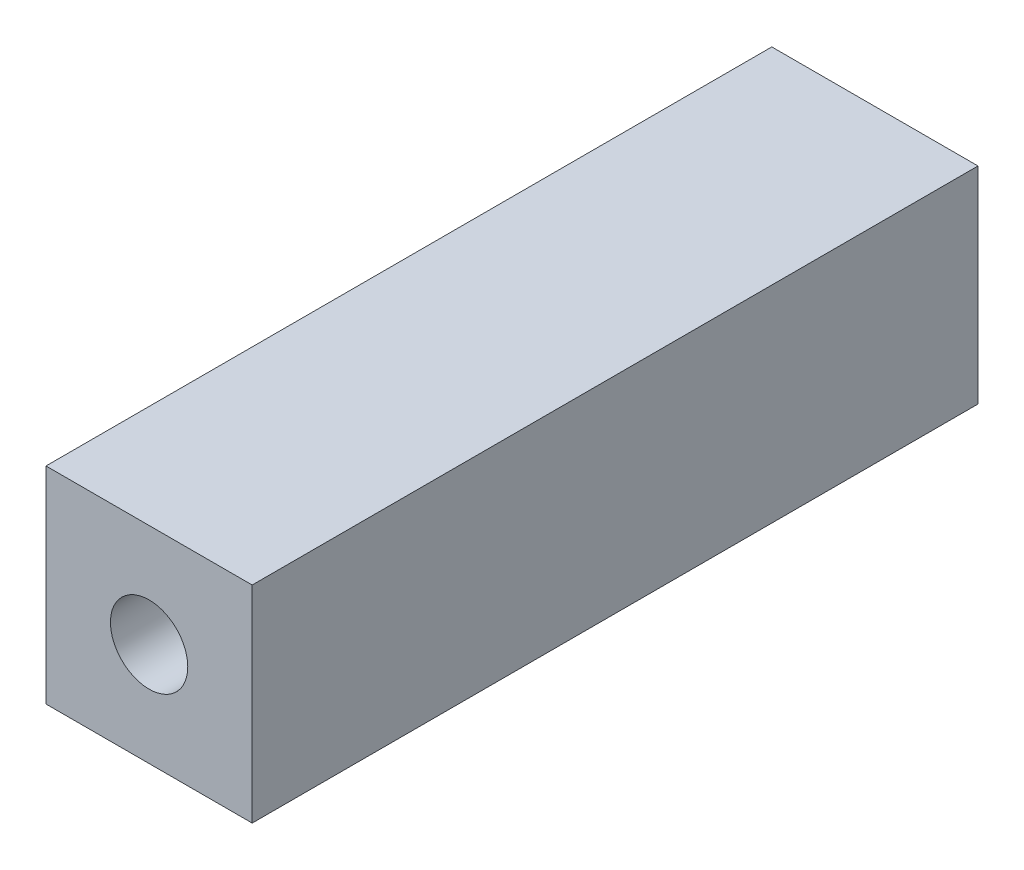
ISO-10303-21;
HEADER;
FILE_DESCRIPTION(('STEP AP214'),'2;1');
FILE_NAME('part.step','',(''),(''),'','','');
FILE_SCHEMA(('AUTOMOTIVE_DESIGN { 1 0 10303 214 1 1 1 1 }'));
ENDSEC;
DATA;
#1=APPLICATION_CONTEXT('core data for automotive mechanical design processes');
#2=APPLICATION_PROTOCOL_DEFINITION('international standard','automotive_design',2000,#1);
#3=PRODUCT_CONTEXT('',#1,'mechanical');
#4=PRODUCT('Part','Part','',(#3));
#5=PRODUCT_RELATED_PRODUCT_CATEGORY('part','',(#4));
#6=PRODUCT_DEFINITION_FORMATION('','',#4);
#7=PRODUCT_DEFINITION_CONTEXT('part definition',#1,'design');
#8=PRODUCT_DEFINITION('design','',#6,#7);
#9=PRODUCT_DEFINITION_SHAPE('','',#8);
#10=(LENGTH_UNIT() NAMED_UNIT(*) SI_UNIT(.MILLI.,.METRE.));
#11=(NAMED_UNIT(*) PLANE_ANGLE_UNIT() SI_UNIT($,.RADIAN.));
#12=(NAMED_UNIT(*) SI_UNIT($,.STERADIAN.) SOLID_ANGLE_UNIT());
#13=UNCERTAINTY_MEASURE_WITH_UNIT(LENGTH_MEASURE(1.E-05),#10,'distance_accuracy_value','');
#14=(GEOMETRIC_REPRESENTATION_CONTEXT(3) GLOBAL_UNCERTAINTY_ASSIGNED_CONTEXT((#13)) GLOBAL_UNIT_ASSIGNED_CONTEXT((#10,
#11,#12)) REPRESENTATION_CONTEXT('',''));
#15=CARTESIAN_POINT('',(0.,0.,0.));
#16=DIRECTION('',(0.,0.,1.));
#17=DIRECTION('',(1.,0.,0.));
#18=AXIS2_PLACEMENT_3D('',#15,#16,#17);
#19=CARTESIAN_POINT('',(0.,0.,89.408));
#20=DIRECTION('',(1.,0.,0.));
#21=DIRECTION('',(0.,0.,-1.));
#22=AXIS2_PLACEMENT_3D('',#19,#20,#21);
#23=PLANE('',#22);
#24=DIRECTION('',(0.,-1.,0.));
#25=VECTOR('',#24,1.);
#26=CARTESIAN_POINT('',(0.,0.,0.));
#27=LINE('',#26,#25);
#28=CARTESIAN_POINT('',(0.,25.4,0.));
#29=VERTEX_POINT('',#28);
#30=CARTESIAN_POINT('',(0.,0.,0.));
#31=VERTEX_POINT('',#30);
#32=EDGE_CURVE('E107',#29,#31,#27,.T.);
#33=ORIENTED_EDGE('',*,*,#32,.T.);
#34=DIRECTION('',(0.,0.,-1.));
#35=VECTOR('',#34,1.);
#36=CARTESIAN_POINT('',(0.,0.,89.408));
#37=LINE('',#36,#35);
#38=CARTESIAN_POINT('',(0.,0.,89.408));
#39=VERTEX_POINT('',#38);
#40=EDGE_CURVE('E11',#39,#31,#37,.T.);
#41=ORIENTED_EDGE('',*,*,#40,.F.);
#42=DIRECTION('',(0.,-1.,0.));
#43=VECTOR('',#42,1.);
#44=CARTESIAN_POINT('',(0.,0.,89.408));
#45=LINE('',#44,#43);
#46=CARTESIAN_POINT('',(0.,25.4,89.408));
#47=VERTEX_POINT('',#46);
#48=EDGE_CURVE('E108',#47,#39,#45,.T.);
#49=ORIENTED_EDGE('',*,*,#48,.F.);
#50=DIRECTION('',(0.,0.,-1.));
#51=VECTOR('',#50,1.);
#52=CARTESIAN_POINT('',(0.,25.4,89.408));
#53=LINE('',#52,#51);
#54=EDGE_CURVE('E114',#47,#29,#53,.T.);
#55=ORIENTED_EDGE('',*,*,#54,.T.);
#56=EDGE_LOOP('',(#33,#41,#49,#55));
#57=FACE_BOUND('',#56,.T.);
#58=ADVANCED_FACE('F32',(#57),#23,.F.);
#59=CARTESIAN_POINT('',(0.,0.,89.408));
#60=DIRECTION('',(0.,1.,0.));
#61=DIRECTION('',(0.,0.,1.));
#62=AXIS2_PLACEMENT_3D('',#59,#60,#61);
#63=PLANE('',#62);
#64=DIRECTION('',(1.,0.,0.));
#65=VECTOR('',#64,1.);
#66=CARTESIAN_POINT('',(0.,0.,0.));
#67=LINE('',#66,#65);
#68=CARTESIAN_POINT('',(25.4,0.,0.));
#69=VERTEX_POINT('',#68);
#70=EDGE_CURVE('E117',#31,#69,#67,.T.);
#71=ORIENTED_EDGE('',*,*,#70,.T.);
#72=DIRECTION('',(0.,0.,-1.));
#73=VECTOR('',#72,1.);
#74=CARTESIAN_POINT('',(25.4,0.,89.408));
#75=LINE('',#74,#73);
#76=CARTESIAN_POINT('',(25.4,0.,89.408));
#77=VERTEX_POINT('',#76);
#78=EDGE_CURVE('E40',#77,#69,#75,.T.);
#79=ORIENTED_EDGE('',*,*,#78,.F.);
#80=DIRECTION('',(1.,0.,0.));
#81=VECTOR('',#80,1.);
#82=CARTESIAN_POINT('',(0.,0.,89.408));
#83=LINE('',#82,#81);
#84=EDGE_CURVE('E79',#39,#77,#83,.T.);
#85=ORIENTED_EDGE('',*,*,#84,.F.);
#86=ORIENTED_EDGE('',*,*,#40,.T.);
#87=EDGE_LOOP('',(#71,#79,#85,#86));
#88=FACE_BOUND('',#87,.T.);
#89=ADVANCED_FACE('F141',(#88),#63,.F.);
#90=CARTESIAN_POINT('',(25.4,0.,89.408));
#91=DIRECTION('',(-1.,0.,0.));
#92=DIRECTION('',(0.,0.,1.));
#93=AXIS2_PLACEMENT_3D('',#90,#91,#92);
#94=PLANE('',#93);
#95=DIRECTION('',(0.,1.,0.));
#96=VECTOR('',#95,1.);
#97=CARTESIAN_POINT('',(25.4,0.,0.));
#98=LINE('',#97,#96);
#99=CARTESIAN_POINT('',(25.4,25.4,0.));
#100=VERTEX_POINT('',#99);
#101=EDGE_CURVE('E66',#69,#100,#98,.T.);
#102=ORIENTED_EDGE('',*,*,#101,.T.);
#103=DIRECTION('',(0.,0.,-1.));
#104=VECTOR('',#103,1.);
#105=CARTESIAN_POINT('',(25.4,25.4,89.408));
#106=LINE('',#105,#104);
#107=CARTESIAN_POINT('',(25.4,25.4,89.408));
#108=VERTEX_POINT('',#107);
#109=EDGE_CURVE('E122',#108,#100,#106,.T.);
#110=ORIENTED_EDGE('',*,*,#109,.F.);
#111=DIRECTION('',(0.,1.,0.));
#112=VECTOR('',#111,1.);
#113=CARTESIAN_POINT('',(25.4,0.,89.408));
#114=LINE('',#113,#112);
#115=EDGE_CURVE('E111',#77,#108,#114,.T.);
#116=ORIENTED_EDGE('',*,*,#115,.F.);
#117=ORIENTED_EDGE('',*,*,#78,.T.);
#118=EDGE_LOOP('',(#102,#110,#116,#117));
#119=FACE_BOUND('',#118,.T.);
#120=ADVANCED_FACE('F124',(#119),#94,.F.);
#121=CARTESIAN_POINT('',(0.,25.4,89.408));
#122=DIRECTION('',(0.,-1.,0.));
#123=DIRECTION('',(0.,0.,-1.));
#124=AXIS2_PLACEMENT_3D('',#121,#122,#123);
#125=PLANE('',#124);
#126=DIRECTION('',(-1.,0.,0.));
#127=VECTOR('',#126,1.);
#128=CARTESIAN_POINT('',(0.,25.4,0.));
#129=LINE('',#128,#127);
#130=EDGE_CURVE('E72',#100,#29,#129,.T.);
#131=ORIENTED_EDGE('',*,*,#130,.T.);
#132=ORIENTED_EDGE('',*,*,#54,.F.);
#133=DIRECTION('',(-1.,0.,0.));
#134=VECTOR('',#133,1.);
#135=CARTESIAN_POINT('',(0.,25.4,89.408));
#136=LINE('',#135,#134);
#137=EDGE_CURVE('E48',#108,#47,#136,.T.);
#138=ORIENTED_EDGE('',*,*,#137,.F.);
#139=ORIENTED_EDGE('',*,*,#109,.T.);
#140=EDGE_LOOP('',(#131,#132,#138,#139));
#141=FACE_BOUND('',#140,.T.);
#142=ADVANCED_FACE('F131',(#141),#125,.F.);
#143=CARTESIAN_POINT('',(0.,0.,89.408));
#144=DIRECTION('',(0.,0.,-1.));
#145=DIRECTION('',(-1.,0.,0.));
#146=AXIS2_PLACEMENT_3D('',#143,#144,#145);
#147=PLANE('',#146);
#148=CARTESIAN_POINT('',(12.7,12.7,89.408));
#149=DIRECTION('',(0.,0.,1.));
#150=DIRECTION('',(1.,0.,0.));
#151=AXIS2_PLACEMENT_3D('',#148,#149,#150);
#152=CIRCLE('',#151,4.76249999999999);
#153=CARTESIAN_POINT('',(17.4625,12.7,89.408));
#154=VERTEX_POINT('',#153);
#155=EDGE_CURVE('E97',#154,#154,#152,.T.);
#156=ORIENTED_EDGE('',*,*,#155,.F.);
#157=EDGE_LOOP('',(#156));
#158=FACE_BOUND('',#157,.T.);
#159=ORIENTED_EDGE('',*,*,#48,.T.);
#160=ORIENTED_EDGE('',*,*,#84,.T.);
#161=ORIENTED_EDGE('',*,*,#115,.T.);
#162=ORIENTED_EDGE('',*,*,#137,.T.);
#163=EDGE_LOOP('',(#159,#160,#161,#162));
#164=FACE_BOUND('',#163,.T.);
#165=ADVANCED_FACE('F133',(#158,#164),#147,.F.);
#166=CARTESIAN_POINT('',(0.,0.,0.));
#167=DIRECTION('',(0.,0.,-1.));
#168=DIRECTION('',(-1.,0.,0.));
#169=AXIS2_PLACEMENT_3D('',#166,#167,#168);
#170=PLANE('',#169);
#171=CARTESIAN_POINT('',(12.7,12.7,0.));
#172=DIRECTION('',(0.,0.,-1.));
#173=DIRECTION('',(-1.,0.,0.));
#174=AXIS2_PLACEMENT_3D('',#171,#172,#173);
#175=CIRCLE('',#174,4.76249999999999);
#176=CARTESIAN_POINT('',(7.93750000000001,12.7,0.));
#177=VERTEX_POINT('',#176);
#178=EDGE_CURVE('E96',#177,#177,#175,.T.);
#179=ORIENTED_EDGE('',*,*,#178,.F.);
#180=EDGE_LOOP('',(#179));
#181=FACE_BOUND('',#180,.T.);
#182=ORIENTED_EDGE('',*,*,#32,.F.);
#183=ORIENTED_EDGE('',*,*,#130,.F.);
#184=ORIENTED_EDGE('',*,*,#101,.F.);
#185=ORIENTED_EDGE('',*,*,#70,.F.);
#186=EDGE_LOOP('',(#182,#183,#184,#185));
#187=FACE_BOUND('',#186,.T.);
#188=ADVANCED_FACE('F127',(#181,#187),#170,.T.);
#189=CARTESIAN_POINT('',(12.7,12.7,25.4));
#190=DIRECTION('',(0.,0.,-1.));
#191=DIRECTION('',(-1.,0.,0.));
#192=AXIS2_PLACEMENT_3D('',#189,#190,#191);
#193=CONICAL_SURFACE('',#192,4.76249999999999,1.02974425867665);
#194=CARTESIAN_POINT('',(12.7,12.7,28.2615986981188));
#195=VERTEX_POINT('',#194);
#196=VERTEX_LOOP('',#195);
#197=FACE_BOUND('',#196,.T.);
#198=CARTESIAN_POINT('',(12.7,12.7,25.4));
#199=DIRECTION('',(0.,0.,-1.));
#200=DIRECTION('',(-1.,0.,0.));
#201=AXIS2_PLACEMENT_3D('',#198,#199,#200);
#202=CIRCLE('',#201,4.76249999999999);
#203=CARTESIAN_POINT('',(7.93750000000001,12.7,25.4));
#204=VERTEX_POINT('',#203);
#205=EDGE_CURVE('E100',#204,#204,#202,.T.);
#206=ORIENTED_EDGE('',*,*,#205,.T.);
#207=EDGE_LOOP('',(#206));
#208=FACE_BOUND('',#207,.T.);
#209=ADVANCED_FACE('F168',(#197,#208),#193,.F.);
#210=CARTESIAN_POINT('',(12.7,12.7,0.));
#211=DIRECTION('',(0.,0.,-1.));
#212=DIRECTION('',(-1.,0.,0.));
#213=AXIS2_PLACEMENT_3D('',#210,#211,#212);
#214=CYLINDRICAL_SURFACE('',#213,4.76249999999999);
#215=ORIENTED_EDGE('',*,*,#205,.F.);
#216=EDGE_LOOP('',(#215));
#217=FACE_BOUND('',#216,.T.);
#218=ORIENTED_EDGE('',*,*,#178,.T.);
#219=EDGE_LOOP('',(#218));
#220=FACE_BOUND('',#219,.T.);
#221=ADVANCED_FACE('F90',(#217,#220),#214,.F.);
#222=CARTESIAN_POINT('',(12.7,12.7,64.008));
#223=DIRECTION('',(0.,0.,1.));
#224=DIRECTION('',(1.,0.,0.));
#225=AXIS2_PLACEMENT_3D('',#222,#223,#224);
#226=CONICAL_SURFACE('',#225,4.76249999999999,1.02974425867665);
#227=CARTESIAN_POINT('',(12.7,12.7,61.1464013018812));
#228=VERTEX_POINT('',#227);
#229=VERTEX_LOOP('',#228);
#230=FACE_BOUND('',#229,.T.);
#231=CARTESIAN_POINT('',(12.7,12.7,64.008));
#232=DIRECTION('',(0.,0.,1.));
#233=DIRECTION('',(1.,0.,0.));
#234=AXIS2_PLACEMENT_3D('',#231,#232,#233);
#235=CIRCLE('',#234,4.76249999999999);
#236=CARTESIAN_POINT('',(17.4625,12.7,64.008));
#237=VERTEX_POINT('',#236);
#238=EDGE_CURVE('E94',#237,#237,#235,.T.);
#239=ORIENTED_EDGE('',*,*,#238,.T.);
#240=EDGE_LOOP('',(#239));
#241=FACE_BOUND('',#240,.T.);
#242=ADVANCED_FACE('F86',(#230,#241),#226,.F.);
#243=CARTESIAN_POINT('',(12.7,12.7,89.408));
#244=DIRECTION('',(0.,0.,1.));
#245=DIRECTION('',(1.,0.,0.));
#246=AXIS2_PLACEMENT_3D('',#243,#244,#245);
#247=CYLINDRICAL_SURFACE('',#246,4.76249999999999);
#248=ORIENTED_EDGE('',*,*,#238,.F.);
#249=EDGE_LOOP('',(#248));
#250=FACE_BOUND('',#249,.T.);
#251=ORIENTED_EDGE('',*,*,#155,.T.);
#252=EDGE_LOOP('',(#251));
#253=FACE_BOUND('',#252,.T.);
#254=ADVANCED_FACE('F89',(#250,#253),#247,.F.);
#255=CLOSED_SHELL('',(#58,#89,#120,#142,#165,#188,#209,#221,#242,#254));
#256=MANIFOLD_SOLID_BREP('B2',#255);
#257=ADVANCED_BREP_SHAPE_REPRESENTATION('',(#18,#256),#14);
#258=SHAPE_DEFINITION_REPRESENTATION(#9,#257);
ENDSEC;
END-ISO-10303-21;
